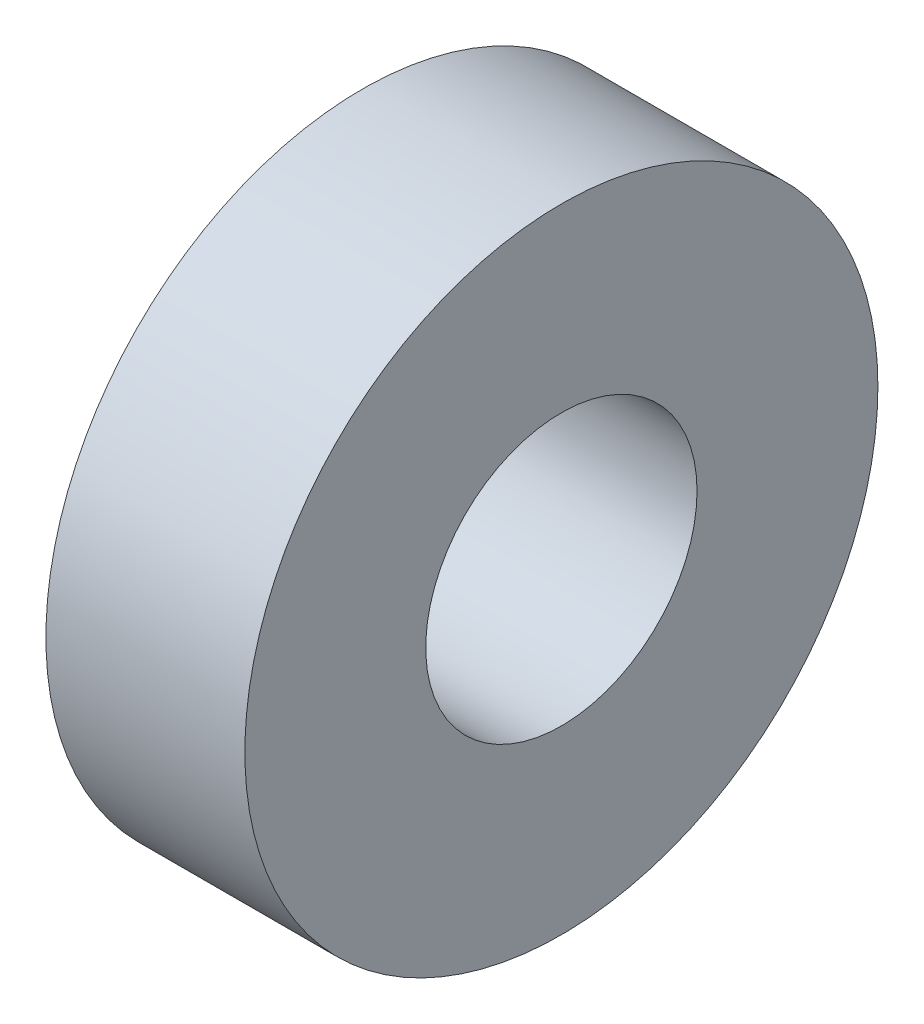
ISO-10303-21;
HEADER;
FILE_DESCRIPTION(('STEP AP214'),'2;1');
FILE_NAME('part.step','',(''),(''),'','','');
FILE_SCHEMA(('AUTOMOTIVE_DESIGN { 1 0 10303 214 1 1 1 1 }'));
ENDSEC;
DATA;
#1=APPLICATION_CONTEXT('core data for automotive mechanical design processes');
#2=APPLICATION_PROTOCOL_DEFINITION('international standard','automotive_design',2000,#1);
#3=PRODUCT_CONTEXT('',#1,'mechanical');
#4=PRODUCT('Part','Part','',(#3));
#5=PRODUCT_RELATED_PRODUCT_CATEGORY('part','',(#4));
#6=PRODUCT_DEFINITION_FORMATION('','',#4);
#7=PRODUCT_DEFINITION_CONTEXT('part definition',#1,'design');
#8=PRODUCT_DEFINITION('design','',#6,#7);
#9=PRODUCT_DEFINITION_SHAPE('','',#8);
#10=(LENGTH_UNIT() NAMED_UNIT(*) SI_UNIT(.MILLI.,.METRE.));
#11=(NAMED_UNIT(*) PLANE_ANGLE_UNIT() SI_UNIT($,.RADIAN.));
#12=(NAMED_UNIT(*) SI_UNIT($,.STERADIAN.) SOLID_ANGLE_UNIT());
#13=UNCERTAINTY_MEASURE_WITH_UNIT(LENGTH_MEASURE(1.E-05),#10,'distance_accuracy_value','');
#14=(GEOMETRIC_REPRESENTATION_CONTEXT(3) GLOBAL_UNCERTAINTY_ASSIGNED_CONTEXT((#13)) GLOBAL_UNIT_ASSIGNED_CONTEXT((#10,
#11,#12)) REPRESENTATION_CONTEXT('',''));
#15=CARTESIAN_POINT('',(0.,0.,0.));
#16=DIRECTION('',(0.,0.,1.));
#17=DIRECTION('',(1.,0.,0.));
#18=AXIS2_PLACEMENT_3D('',#15,#16,#17);
#19=CARTESIAN_POINT('',(0.01220000000001,17.5122,17.5122));
#20=DIRECTION('',(1.,0.,0.));
#21=DIRECTION('',(0.,0.,-1.));
#22=AXIS2_PLACEMENT_3D('',#19,#20,#21);
#23=CYLINDRICAL_SURFACE('',#22,7.5);
#24=CARTESIAN_POINT('',(0.01220000000001,17.5122,17.5122));
#25=DIRECTION('',(1.,0.,0.));
#26=DIRECTION('',(0.,0.,-1.));
#27=AXIS2_PLACEMENT_3D('',#24,#25,#26);
#28=CIRCLE('',#27,7.5);
#29=CARTESIAN_POINT('',(0.01220000000001,17.5122,10.0122));
#30=VERTEX_POINT('',#29);
#31=EDGE_CURVE('E25',#30,#30,#28,.F.);
#32=ORIENTED_EDGE('',*,*,#31,.T.);
#33=EDGE_LOOP('',(#32));
#34=FACE_BOUND('',#33,.T.);
#35=CARTESIAN_POINT('',(11.0122,17.5122,17.5122));
#36=DIRECTION('',(1.,0.,0.));
#37=DIRECTION('',(0.,0.,-1.));
#38=AXIS2_PLACEMENT_3D('',#35,#36,#37);
#39=CIRCLE('',#38,7.5);
#40=CARTESIAN_POINT('',(11.0122,17.5122,10.0122));
#41=VERTEX_POINT('',#40);
#42=EDGE_CURVE('E16',#41,#41,#39,.F.);
#43=ORIENTED_EDGE('',*,*,#42,.F.);
#44=EDGE_LOOP('',(#43));
#45=FACE_BOUND('',#44,.T.);
#46=ADVANCED_FACE('F13',(#34,#45),#23,.F.);
#47=CARTESIAN_POINT('',(11.0122,17.5122,17.5122));
#48=DIRECTION('',(1.,0.,0.));
#49=DIRECTION('',(0.,0.,-1.));
#50=AXIS2_PLACEMENT_3D('',#47,#48,#49);
#51=PLANE('',#50);
#52=ORIENTED_EDGE('',*,*,#42,.T.);
#53=EDGE_LOOP('',(#52));
#54=FACE_BOUND('',#53,.T.);
#55=CARTESIAN_POINT('',(11.0122,17.5122,17.5122));
#56=DIRECTION('',(1.,0.,0.));
#57=DIRECTION('',(0.,0.,-1.));
#58=AXIS2_PLACEMENT_3D('',#55,#56,#57);
#59=CIRCLE('',#58,17.5);
#60=CARTESIAN_POINT('',(11.0122,17.5122,0.0122000000000004));
#61=VERTEX_POINT('',#60);
#62=EDGE_CURVE('E20',#61,#61,#59,.F.);
#63=ORIENTED_EDGE('',*,*,#62,.F.);
#64=EDGE_LOOP('',(#63));
#65=FACE_BOUND('',#64,.T.);
#66=ADVANCED_FACE('F33',(#54,#65),#51,.T.);
#67=CARTESIAN_POINT('',(0.01220000000001,17.5122,17.5122));
#68=DIRECTION('',(1.,0.,0.));
#69=DIRECTION('',(0.,0.,-1.));
#70=AXIS2_PLACEMENT_3D('',#67,#68,#69);
#71=PLANE('',#70);
#72=ORIENTED_EDGE('',*,*,#31,.F.);
#73=EDGE_LOOP('',(#72));
#74=FACE_BOUND('',#73,.T.);
#75=CARTESIAN_POINT('',(0.01220000000001,17.5122,17.5122));
#76=DIRECTION('',(1.,0.,0.));
#77=DIRECTION('',(0.,0.,-1.));
#78=AXIS2_PLACEMENT_3D('',#75,#76,#77);
#79=CIRCLE('',#78,17.5);
#80=CARTESIAN_POINT('',(0.01220000000001,17.5122,0.0122000000000004));
#81=VERTEX_POINT('',#80);
#82=EDGE_CURVE('E8',#81,#81,#79,.T.);
#83=ORIENTED_EDGE('',*,*,#82,.F.);
#84=EDGE_LOOP('',(#83));
#85=FACE_BOUND('',#84,.T.);
#86=ADVANCED_FACE('F41',(#74,#85),#71,.F.);
#87=CARTESIAN_POINT('',(0.01220000000001,17.5122,17.5122));
#88=DIRECTION('',(1.,0.,0.));
#89=DIRECTION('',(0.,0.,-1.));
#90=AXIS2_PLACEMENT_3D('',#87,#88,#89);
#91=CYLINDRICAL_SURFACE('',#90,17.5);
#92=ORIENTED_EDGE('',*,*,#82,.T.);
#93=EDGE_LOOP('',(#92));
#94=FACE_BOUND('',#93,.T.);
#95=ORIENTED_EDGE('',*,*,#62,.T.);
#96=EDGE_LOOP('',(#95));
#97=FACE_BOUND('',#96,.T.);
#98=ADVANCED_FACE('F42',(#94,#97),#91,.T.);
#99=CLOSED_SHELL('',(#46,#66,#86,#98));
#100=MANIFOLD_SOLID_BREP('B1',#99);
#101=ADVANCED_BREP_SHAPE_REPRESENTATION('',(#18,#100),#14);
#102=SHAPE_DEFINITION_REPRESENTATION(#9,#101);
ENDSEC;
END-ISO-10303-21;
